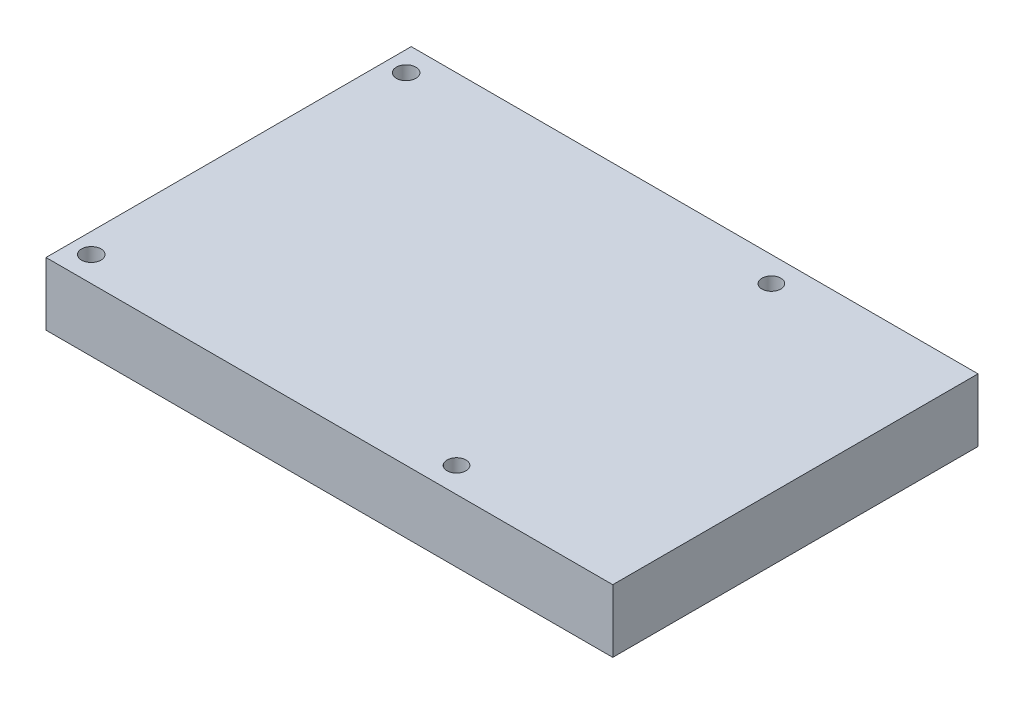
ISO-10303-21;
HEADER;
FILE_DESCRIPTION(('STEP AP214'),'2;1');
FILE_NAME('part.step','',(''),(''),'','','');
FILE_SCHEMA(('AUTOMOTIVE_DESIGN { 1 0 10303 214 1 1 1 1 }'));
ENDSEC;
DATA;
#1=APPLICATION_CONTEXT('core data for automotive mechanical design processes');
#2=APPLICATION_PROTOCOL_DEFINITION('international standard','automotive_design',2000,#1);
#3=PRODUCT_CONTEXT('',#1,'mechanical');
#4=PRODUCT('Part','Part','',(#3));
#5=PRODUCT_RELATED_PRODUCT_CATEGORY('part','',(#4));
#6=PRODUCT_DEFINITION_FORMATION('','',#4);
#7=PRODUCT_DEFINITION_CONTEXT('part definition',#1,'design');
#8=PRODUCT_DEFINITION('design','',#6,#7);
#9=PRODUCT_DEFINITION_SHAPE('','',#8);
#10=(LENGTH_UNIT() NAMED_UNIT(*) SI_UNIT(.MILLI.,.METRE.));
#11=(NAMED_UNIT(*) PLANE_ANGLE_UNIT() SI_UNIT($,.RADIAN.));
#12=(NAMED_UNIT(*) SI_UNIT($,.STERADIAN.) SOLID_ANGLE_UNIT());
#13=UNCERTAINTY_MEASURE_WITH_UNIT(LENGTH_MEASURE(1.E-05),#10,'distance_accuracy_value','');
#14=(GEOMETRIC_REPRESENTATION_CONTEXT(3) GLOBAL_UNCERTAINTY_ASSIGNED_CONTEXT((#13)) GLOBAL_UNIT_ASSIGNED_CONTEXT((#10,
#11,#12)) REPRESENTATION_CONTEXT('',''));
#15=CARTESIAN_POINT('',(0.,0.,0.));
#16=DIRECTION('',(0.,0.,1.));
#17=DIRECTION('',(1.,0.,0.));
#18=AXIS2_PLACEMENT_3D('',#15,#16,#17);
#19=CARTESIAN_POINT('',(45.,10.,29.));
#20=DIRECTION('',(-1.,0.,0.));
#21=DIRECTION('',(0.,0.,1.));
#22=AXIS2_PLACEMENT_3D('',#19,#20,#21);
#23=PLANE('',#22);
#24=DIRECTION('',(0.,0.,-1.));
#25=VECTOR('',#24,1.);
#26=CARTESIAN_POINT('',(45.,0.,29.));
#27=LINE('',#26,#25);
#28=CARTESIAN_POINT('',(45.,0.,29.));
#29=VERTEX_POINT('',#28);
#30=CARTESIAN_POINT('',(45.,0.,-29.));
#31=VERTEX_POINT('',#30);
#32=EDGE_CURVE('E106',#29,#31,#27,.T.);
#33=ORIENTED_EDGE('',*,*,#32,.T.);
#34=DIRECTION('',(0.,-1.,0.));
#35=VECTOR('',#34,1.);
#36=CARTESIAN_POINT('',(45.,10.,-29.));
#37=LINE('',#36,#35);
#38=CARTESIAN_POINT('',(45.,10.,-29.));
#39=VERTEX_POINT('',#38);
#40=EDGE_CURVE('E11',#39,#31,#37,.T.);
#41=ORIENTED_EDGE('',*,*,#40,.F.);
#42=DIRECTION('',(0.,0.,-1.));
#43=VECTOR('',#42,1.);
#44=CARTESIAN_POINT('',(45.,10.,29.));
#45=LINE('',#44,#43);
#46=CARTESIAN_POINT('',(45.,10.,29.));
#47=VERTEX_POINT('',#46);
#48=EDGE_CURVE('E94',#47,#39,#45,.T.);
#49=ORIENTED_EDGE('',*,*,#48,.F.);
#50=DIRECTION('',(0.,-1.,0.));
#51=VECTOR('',#50,1.);
#52=CARTESIAN_POINT('',(45.,10.,29.));
#53=LINE('',#52,#51);
#54=EDGE_CURVE('E102',#47,#29,#53,.T.);
#55=ORIENTED_EDGE('',*,*,#54,.T.);
#56=EDGE_LOOP('',(#33,#41,#49,#55));
#57=FACE_BOUND('',#56,.T.);
#58=ADVANCED_FACE('F43',(#57),#23,.F.);
#59=CARTESIAN_POINT('',(-45.,10.,-29.));
#60=DIRECTION('',(0.,0.,1.));
#61=DIRECTION('',(1.,0.,0.));
#62=AXIS2_PLACEMENT_3D('',#59,#60,#61);
#63=PLANE('',#62);
#64=DIRECTION('',(-1.,0.,0.));
#65=VECTOR('',#64,1.);
#66=CARTESIAN_POINT('',(-45.,0.,-29.));
#67=LINE('',#66,#65);
#68=CARTESIAN_POINT('',(-45.,0.,-29.));
#69=VERTEX_POINT('',#68);
#70=EDGE_CURVE('E98',#31,#69,#67,.T.);
#71=ORIENTED_EDGE('',*,*,#70,.T.);
#72=DIRECTION('',(0.,-1.,0.));
#73=VECTOR('',#72,1.);
#74=CARTESIAN_POINT('',(-45.,10.,-29.));
#75=LINE('',#74,#73);
#76=CARTESIAN_POINT('',(-45.,10.,-29.));
#77=VERTEX_POINT('',#76);
#78=EDGE_CURVE('E51',#77,#69,#75,.T.);
#79=ORIENTED_EDGE('',*,*,#78,.F.);
#80=DIRECTION('',(-1.,0.,0.));
#81=VECTOR('',#80,1.);
#82=CARTESIAN_POINT('',(-45.,10.,-29.));
#83=LINE('',#82,#81);
#84=EDGE_CURVE('E89',#39,#77,#83,.T.);
#85=ORIENTED_EDGE('',*,*,#84,.F.);
#86=ORIENTED_EDGE('',*,*,#40,.T.);
#87=EDGE_LOOP('',(#71,#79,#85,#86));
#88=FACE_BOUND('',#87,.T.);
#89=ADVANCED_FACE('F97',(#88),#63,.F.);
#90=CARTESIAN_POINT('',(-45.,10.,29.));
#91=DIRECTION('',(1.,0.,0.));
#92=DIRECTION('',(0.,0.,-1.));
#93=AXIS2_PLACEMENT_3D('',#90,#91,#92);
#94=PLANE('',#93);
#95=DIRECTION('',(0.,0.,1.));
#96=VECTOR('',#95,1.);
#97=CARTESIAN_POINT('',(-45.,0.,29.));
#98=LINE('',#97,#96);
#99=CARTESIAN_POINT('',(-45.,0.,29.));
#100=VERTEX_POINT('',#99);
#101=EDGE_CURVE('E76',#69,#100,#98,.T.);
#102=ORIENTED_EDGE('',*,*,#101,.T.);
#103=DIRECTION('',(0.,-1.,0.));
#104=VECTOR('',#103,1.);
#105=CARTESIAN_POINT('',(-45.,10.,29.));
#106=LINE('',#105,#104);
#107=CARTESIAN_POINT('',(-45.,10.,29.));
#108=VERTEX_POINT('',#107);
#109=EDGE_CURVE('E99',#108,#100,#106,.T.);
#110=ORIENTED_EDGE('',*,*,#109,.F.);
#111=DIRECTION('',(0.,0.,1.));
#112=VECTOR('',#111,1.);
#113=CARTESIAN_POINT('',(-45.,10.,29.));
#114=LINE('',#113,#112);
#115=EDGE_CURVE('E92',#77,#108,#114,.T.);
#116=ORIENTED_EDGE('',*,*,#115,.F.);
#117=ORIENTED_EDGE('',*,*,#78,.T.);
#118=EDGE_LOOP('',(#102,#110,#116,#117));
#119=FACE_BOUND('',#118,.T.);
#120=ADVANCED_FACE('F100',(#119),#94,.F.);
#121=CARTESIAN_POINT('',(-45.,10.,29.));
#122=DIRECTION('',(0.,0.,-1.));
#123=DIRECTION('',(-1.,0.,0.));
#124=AXIS2_PLACEMENT_3D('',#121,#122,#123);
#125=PLANE('',#124);
#126=DIRECTION('',(1.,0.,0.));
#127=VECTOR('',#126,1.);
#128=CARTESIAN_POINT('',(-45.,0.,29.));
#129=LINE('',#128,#127);
#130=EDGE_CURVE('E82',#100,#29,#129,.T.);
#131=ORIENTED_EDGE('',*,*,#130,.T.);
#132=ORIENTED_EDGE('',*,*,#54,.F.);
#133=DIRECTION('',(1.,0.,0.));
#134=VECTOR('',#133,1.);
#135=CARTESIAN_POINT('',(-45.,10.,29.));
#136=LINE('',#135,#134);
#137=EDGE_CURVE('E59',#108,#47,#136,.T.);
#138=ORIENTED_EDGE('',*,*,#137,.F.);
#139=ORIENTED_EDGE('',*,*,#109,.T.);
#140=EDGE_LOOP('',(#131,#132,#138,#139));
#141=FACE_BOUND('',#140,.T.);
#142=ADVANCED_FACE('F114',(#141),#125,.F.);
#143=CARTESIAN_POINT('',(0.,10.,0.));
#144=DIRECTION('',(0.,-1.,0.));
#145=DIRECTION('',(0.,0.,-1.));
#146=AXIS2_PLACEMENT_3D('',#143,#144,#145);
#147=PLANE('',#146);
#148=CARTESIAN_POINT('',(16.1903464777124,10.,-25.));
#149=DIRECTION('',(0.,1.,0.));
#150=DIRECTION('',(0.,0.,1.));
#151=AXIS2_PLACEMENT_3D('',#148,#149,#150);
#152=CIRCLE('',#151,1.5);
#153=CARTESIAN_POINT('',(16.1903464777124,10.,-23.5));
#154=VERTEX_POINT('',#153);
#155=EDGE_CURVE('E123',#154,#154,#152,.T.);
#156=ORIENTED_EDGE('',*,*,#155,.F.);
#157=EDGE_LOOP('',(#156));
#158=FACE_BOUND('',#157,.T.);
#159=CARTESIAN_POINT('',(-41.8096535222876,10.,25.));
#160=DIRECTION('',(0.,1.,0.));
#161=DIRECTION('',(0.,0.,-1.));
#162=AXIS2_PLACEMENT_3D('',#159,#160,#161);
#163=CIRCLE('',#162,1.55);
#164=CARTESIAN_POINT('',(-41.8096535222876,10.,23.45));
#165=VERTEX_POINT('',#164);
#166=EDGE_CURVE('E129',#165,#165,#163,.T.);
#167=ORIENTED_EDGE('',*,*,#166,.F.);
#168=EDGE_LOOP('',(#167));
#169=FACE_BOUND('',#168,.T.);
#170=CARTESIAN_POINT('',(16.1903464777124,10.,25.));
#171=DIRECTION('',(0.,1.,0.));
#172=DIRECTION('',(0.,0.,-1.));
#173=AXIS2_PLACEMENT_3D('',#170,#171,#172);
#174=CIRCLE('',#173,1.5);
#175=CARTESIAN_POINT('',(16.1903464777124,10.,23.5));
#176=VERTEX_POINT('',#175);
#177=EDGE_CURVE('E130',#176,#176,#174,.T.);
#178=ORIENTED_EDGE('',*,*,#177,.F.);
#179=EDGE_LOOP('',(#178));
#180=FACE_BOUND('',#179,.T.);
#181=CARTESIAN_POINT('',(-41.8096535222876,10.,-25.));
#182=DIRECTION('',(0.,1.,0.));
#183=DIRECTION('',(0.,0.,1.));
#184=AXIS2_PLACEMENT_3D('',#181,#182,#183);
#185=CIRCLE('',#184,1.55);
#186=CARTESIAN_POINT('',(-41.8096535222876,10.,-23.45));
#187=VERTEX_POINT('',#186);
#188=EDGE_CURVE('E120',#187,#187,#185,.T.);
#189=ORIENTED_EDGE('',*,*,#188,.F.);
#190=EDGE_LOOP('',(#189));
#191=FACE_BOUND('',#190,.T.);
#192=ORIENTED_EDGE('',*,*,#48,.T.);
#193=ORIENTED_EDGE('',*,*,#84,.T.);
#194=ORIENTED_EDGE('',*,*,#115,.T.);
#195=ORIENTED_EDGE('',*,*,#137,.T.);
#196=EDGE_LOOP('',(#192,#193,#194,#195));
#197=FACE_BOUND('',#196,.T.);
#198=ADVANCED_FACE('F90',(#158,#169,#180,#191,#197),#147,.F.);
#199=CARTESIAN_POINT('',(0.,0.,0.));
#200=DIRECTION('',(0.,-1.,0.));
#201=DIRECTION('',(0.,0.,-1.));
#202=AXIS2_PLACEMENT_3D('',#199,#200,#201);
#203=PLANE('',#202);
#204=CARTESIAN_POINT('',(16.1903464777124,0.,-25.));
#205=DIRECTION('',(0.,1.,0.));
#206=DIRECTION('',(0.,0.,1.));
#207=AXIS2_PLACEMENT_3D('',#204,#205,#206);
#208=CIRCLE('',#207,1.5);
#209=CARTESIAN_POINT('',(16.1903464777124,0.,-23.5));
#210=VERTEX_POINT('',#209);
#211=EDGE_CURVE('E133',#210,#210,#208,.T.);
#212=ORIENTED_EDGE('',*,*,#211,.T.);
#213=EDGE_LOOP('',(#212));
#214=FACE_BOUND('',#213,.T.);
#215=CARTESIAN_POINT('',(-41.8096535222876,0.,25.));
#216=DIRECTION('',(0.,1.,0.));
#217=DIRECTION('',(0.,0.,-1.));
#218=AXIS2_PLACEMENT_3D('',#215,#216,#217);
#219=CIRCLE('',#218,1.55);
#220=CARTESIAN_POINT('',(-41.8096535222876,0.,23.45));
#221=VERTEX_POINT('',#220);
#222=EDGE_CURVE('E126',#221,#221,#219,.T.);
#223=ORIENTED_EDGE('',*,*,#222,.T.);
#224=EDGE_LOOP('',(#223));
#225=FACE_BOUND('',#224,.T.);
#226=CARTESIAN_POINT('',(16.1903464777124,0.,25.));
#227=DIRECTION('',(0.,1.,0.));
#228=DIRECTION('',(0.,0.,-1.));
#229=AXIS2_PLACEMENT_3D('',#226,#227,#228);
#230=CIRCLE('',#229,1.5);
#231=CARTESIAN_POINT('',(16.1903464777124,0.,23.5));
#232=VERTEX_POINT('',#231);
#233=EDGE_CURVE('E138',#232,#232,#230,.T.);
#234=ORIENTED_EDGE('',*,*,#233,.T.);
#235=EDGE_LOOP('',(#234));
#236=FACE_BOUND('',#235,.T.);
#237=CARTESIAN_POINT('',(-41.8096535222876,0.,-25.));
#238=DIRECTION('',(0.,1.,0.));
#239=DIRECTION('',(0.,0.,1.));
#240=AXIS2_PLACEMENT_3D('',#237,#238,#239);
#241=CIRCLE('',#240,1.55);
#242=CARTESIAN_POINT('',(-41.8096535222876,0.,-23.45));
#243=VERTEX_POINT('',#242);
#244=EDGE_CURVE('E109',#243,#243,#241,.T.);
#245=ORIENTED_EDGE('',*,*,#244,.T.);
#246=EDGE_LOOP('',(#245));
#247=FACE_BOUND('',#246,.T.);
#248=ORIENTED_EDGE('',*,*,#32,.F.);
#249=ORIENTED_EDGE('',*,*,#130,.F.);
#250=ORIENTED_EDGE('',*,*,#101,.F.);
#251=ORIENTED_EDGE('',*,*,#70,.F.);
#252=EDGE_LOOP('',(#248,#249,#250,#251));
#253=FACE_BOUND('',#252,.T.);
#254=ADVANCED_FACE('F117',(#214,#225,#236,#247,#253),#203,.T.);
#255=CARTESIAN_POINT('',(-41.8096535222876,0.,-25.));
#256=DIRECTION('',(0.,1.,0.));
#257=DIRECTION('',(0.,0.,1.));
#258=AXIS2_PLACEMENT_3D('',#255,#256,#257);
#259=CYLINDRICAL_SURFACE('',#258,1.55);
#260=ORIENTED_EDGE('',*,*,#244,.F.);
#261=EDGE_LOOP('',(#260));
#262=FACE_BOUND('',#261,.T.);
#263=ORIENTED_EDGE('',*,*,#188,.T.);
#264=EDGE_LOOP('',(#263));
#265=FACE_BOUND('',#264,.T.);
#266=ADVANCED_FACE('F152',(#262,#265),#259,.F.);
#267=CARTESIAN_POINT('',(16.1903464777124,0.,25.));
#268=DIRECTION('',(0.,1.,0.));
#269=DIRECTION('',(0.,0.,1.));
#270=AXIS2_PLACEMENT_3D('',#267,#268,#269);
#271=CYLINDRICAL_SURFACE('',#270,1.5);
#272=ORIENTED_EDGE('',*,*,#233,.F.);
#273=EDGE_LOOP('',(#272));
#274=FACE_BOUND('',#273,.T.);
#275=ORIENTED_EDGE('',*,*,#177,.T.);
#276=EDGE_LOOP('',(#275));
#277=FACE_BOUND('',#276,.T.);
#278=ADVANCED_FACE('F144',(#274,#277),#271,.F.);
#279=CARTESIAN_POINT('',(-41.8096535222876,0.,25.));
#280=DIRECTION('',(0.,1.,0.));
#281=DIRECTION('',(0.,0.,1.));
#282=AXIS2_PLACEMENT_3D('',#279,#280,#281);
#283=CYLINDRICAL_SURFACE('',#282,1.55);
#284=ORIENTED_EDGE('',*,*,#222,.F.);
#285=EDGE_LOOP('',(#284));
#286=FACE_BOUND('',#285,.T.);
#287=ORIENTED_EDGE('',*,*,#166,.T.);
#288=EDGE_LOOP('',(#287));
#289=FACE_BOUND('',#288,.T.);
#290=ADVANCED_FACE('F160',(#286,#289),#283,.F.);
#291=CARTESIAN_POINT('',(16.1903464777124,0.,-25.));
#292=DIRECTION('',(0.,1.,0.));
#293=DIRECTION('',(0.,0.,1.));
#294=AXIS2_PLACEMENT_3D('',#291,#292,#293);
#295=CYLINDRICAL_SURFACE('',#294,1.5);
#296=ORIENTED_EDGE('',*,*,#211,.F.);
#297=EDGE_LOOP('',(#296));
#298=FACE_BOUND('',#297,.T.);
#299=ORIENTED_EDGE('',*,*,#155,.T.);
#300=EDGE_LOOP('',(#299));
#301=FACE_BOUND('',#300,.T.);
#302=ADVANCED_FACE('F211',(#298,#301),#295,.F.);
#303=CLOSED_SHELL('',(#58,#89,#120,#142,#198,#254,#266,#278,#290,#302));
#304=MANIFOLD_SOLID_BREP('B2',#303);
#305=ADVANCED_BREP_SHAPE_REPRESENTATION('',(#18,#304),#14);
#306=SHAPE_DEFINITION_REPRESENTATION(#9,#305);
ENDSEC;
END-ISO-10303-21;
